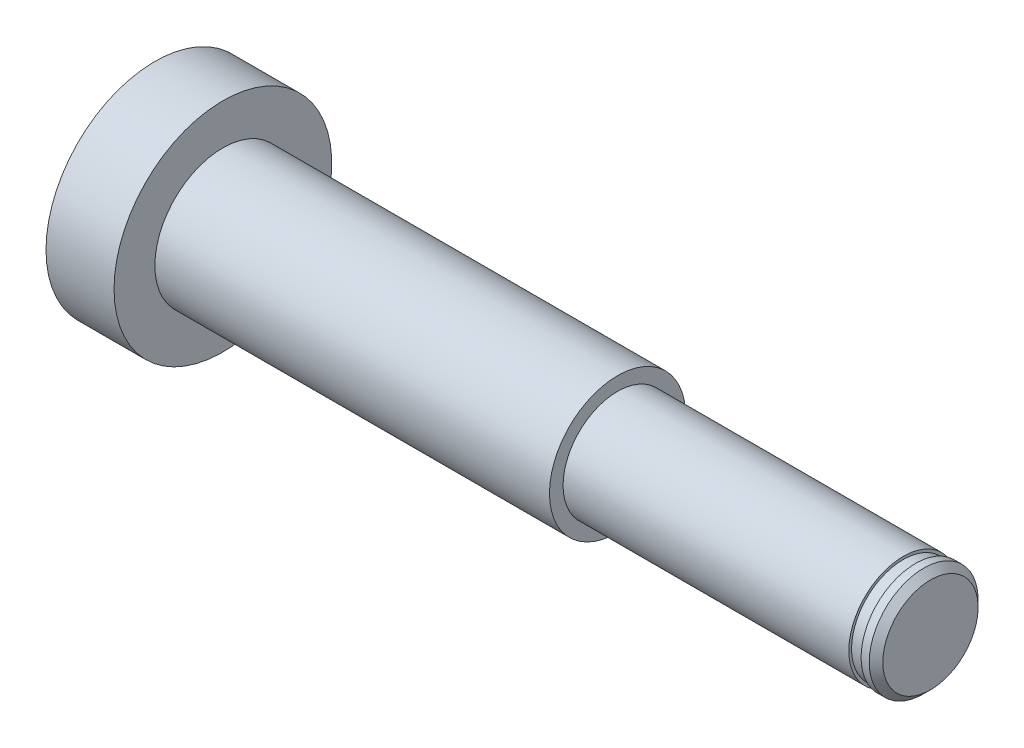
ISO-10303-21;
HEADER;
FILE_DESCRIPTION(('STEP AP214'),'2;1');
FILE_NAME('part.step','',(''),(''),'','','');
FILE_SCHEMA(('AUTOMOTIVE_DESIGN { 1 0 10303 214 1 1 1 1 }'));
ENDSEC;
DATA;
#1=APPLICATION_CONTEXT('core data for automotive mechanical design processes');
#2=APPLICATION_PROTOCOL_DEFINITION('international standard','automotive_design',2000,#1);
#3=PRODUCT_CONTEXT('',#1,'mechanical');
#4=PRODUCT('Part','Part','',(#3));
#5=PRODUCT_RELATED_PRODUCT_CATEGORY('part','',(#4));
#6=PRODUCT_DEFINITION_FORMATION('','',#4);
#7=PRODUCT_DEFINITION_CONTEXT('part definition',#1,'design');
#8=PRODUCT_DEFINITION('design','',#6,#7);
#9=PRODUCT_DEFINITION_SHAPE('','',#8);
#10=(LENGTH_UNIT() NAMED_UNIT(*) SI_UNIT(.MILLI.,.METRE.));
#11=(NAMED_UNIT(*) PLANE_ANGLE_UNIT() SI_UNIT($,.RADIAN.));
#12=(NAMED_UNIT(*) SI_UNIT($,.STERADIAN.) SOLID_ANGLE_UNIT());
#13=UNCERTAINTY_MEASURE_WITH_UNIT(LENGTH_MEASURE(1.E-05),#10,'distance_accuracy_value','');
#14=(GEOMETRIC_REPRESENTATION_CONTEXT(3) GLOBAL_UNCERTAINTY_ASSIGNED_CONTEXT((#13)) GLOBAL_UNIT_ASSIGNED_CONTEXT((#10,
#11,#12)) REPRESENTATION_CONTEXT('',''));
#15=CARTESIAN_POINT('',(0.,0.,0.));
#16=DIRECTION('',(0.,0.,1.));
#17=DIRECTION('',(1.,0.,0.));
#18=AXIS2_PLACEMENT_3D('',#15,#16,#17);
#19=CARTESIAN_POINT('',(-5.,0.,0.));
#20=DIRECTION('',(1.,0.,0.));
#21=DIRECTION('',(0.,0.,-1.));
#22=AXIS2_PLACEMENT_3D('',#19,#20,#21);
#23=PLANE('',#22);
#24=CARTESIAN_POINT('',(-5.,0.,0.));
#25=DIRECTION('',(-1.,0.,0.));
#26=DIRECTION('',(0.,0.,1.));
#27=AXIS2_PLACEMENT_3D('',#24,#25,#26);
#28=CIRCLE('',#27,8.);
#29=CARTESIAN_POINT('',(-5.,0.,8.));
#30=VERTEX_POINT('',#29);
#31=EDGE_CURVE('E43',#30,#30,#28,.T.);
#32=ORIENTED_EDGE('',*,*,#31,.T.);
#33=EDGE_LOOP('',(#32));
#34=FACE_BOUND('',#33,.T.);
#35=ADVANCED_FACE('F32',(#34),#23,.F.);
#36=CARTESIAN_POINT('',(0.,0.,0.));
#37=DIRECTION('',(-1.,0.,0.));
#38=DIRECTION('',(0.,0.,1.));
#39=AXIS2_PLACEMENT_3D('',#36,#37,#38);
#40=CYLINDRICAL_SURFACE('',#39,8.);
#41=ORIENTED_EDGE('',*,*,#31,.F.);
#42=EDGE_LOOP('',(#41));
#43=FACE_BOUND('',#42,.T.);
#44=CARTESIAN_POINT('',(0.,0.,0.));
#45=DIRECTION('',(-1.,0.,0.));
#46=DIRECTION('',(0.,0.,1.));
#47=AXIS2_PLACEMENT_3D('',#44,#45,#46);
#48=CIRCLE('',#47,8.);
#49=CARTESIAN_POINT('',(0.,0.,8.));
#50=VERTEX_POINT('',#49);
#51=EDGE_CURVE('E47',#50,#50,#48,.T.);
#52=ORIENTED_EDGE('',*,*,#51,.T.);
#53=EDGE_LOOP('',(#52));
#54=FACE_BOUND('',#53,.T.);
#55=ADVANCED_FACE('F89',(#43,#54),#40,.T.);
#56=CARTESIAN_POINT('',(0.,5.,0.));
#57=DIRECTION('',(-1.,0.,0.));
#58=DIRECTION('',(0.,0.,1.));
#59=AXIS2_PLACEMENT_3D('',#56,#57,#58);
#60=PLANE('',#59);
#61=ORIENTED_EDGE('',*,*,#51,.F.);
#62=EDGE_LOOP('',(#61));
#63=FACE_BOUND('',#62,.T.);
#64=CARTESIAN_POINT('',(0.,0.,0.));
#65=DIRECTION('',(-1.,0.,0.));
#66=DIRECTION('',(0.,0.,1.));
#67=AXIS2_PLACEMENT_3D('',#64,#65,#66);
#68=CIRCLE('',#67,5.);
#69=CARTESIAN_POINT('',(0.,0.,5.));
#70=VERTEX_POINT('',#69);
#71=EDGE_CURVE('E52',#70,#70,#68,.T.);
#72=ORIENTED_EDGE('',*,*,#71,.T.);
#73=EDGE_LOOP('',(#72));
#74=FACE_BOUND('',#73,.T.);
#75=ADVANCED_FACE('F94',(#63,#74),#60,.F.);
#76=CARTESIAN_POINT('',(0.,0.,0.));
#77=DIRECTION('',(-1.,0.,0.));
#78=DIRECTION('',(0.,0.,1.));
#79=AXIS2_PLACEMENT_3D('',#76,#77,#78);
#80=CYLINDRICAL_SURFACE('',#79,5.);
#81=ORIENTED_EDGE('',*,*,#71,.F.);
#82=EDGE_LOOP('',(#81));
#83=FACE_BOUND('',#82,.T.);
#84=CARTESIAN_POINT('',(29.,0.,0.));
#85=DIRECTION('',(-1.,0.,0.));
#86=DIRECTION('',(0.,0.,1.));
#87=AXIS2_PLACEMENT_3D('',#84,#85,#86);
#88=CIRCLE('',#87,5.);
#89=CARTESIAN_POINT('',(29.,0.,5.));
#90=VERTEX_POINT('',#89);
#91=EDGE_CURVE('E55',#90,#90,#88,.T.);
#92=ORIENTED_EDGE('',*,*,#91,.T.);
#93=EDGE_LOOP('',(#92));
#94=FACE_BOUND('',#93,.T.);
#95=ADVANCED_FACE('F100',(#83,#94),#80,.T.);
#96=CARTESIAN_POINT('',(29.,5.,0.));
#97=DIRECTION('',(-1.,0.,0.));
#98=DIRECTION('',(0.,0.,1.));
#99=AXIS2_PLACEMENT_3D('',#96,#97,#98);
#100=PLANE('',#99);
#101=ORIENTED_EDGE('',*,*,#91,.F.);
#102=EDGE_LOOP('',(#101));
#103=FACE_BOUND('',#102,.T.);
#104=CARTESIAN_POINT('',(29.,0.,0.));
#105=DIRECTION('',(-1.,0.,0.));
#106=DIRECTION('',(0.,0.,1.));
#107=AXIS2_PLACEMENT_3D('',#104,#105,#106);
#108=CIRCLE('',#107,4.);
#109=CARTESIAN_POINT('',(29.,0.,4.));
#110=VERTEX_POINT('',#109);
#111=EDGE_CURVE('E58',#110,#110,#108,.T.);
#112=ORIENTED_EDGE('',*,*,#111,.T.);
#113=EDGE_LOOP('',(#112));
#114=FACE_BOUND('',#113,.T.);
#115=ADVANCED_FACE('F104',(#103,#114),#100,.F.);
#116=CARTESIAN_POINT('',(0.,0.,0.));
#117=DIRECTION('',(-1.,0.,0.));
#118=DIRECTION('',(0.,0.,1.));
#119=AXIS2_PLACEMENT_3D('',#116,#117,#118);
#120=CYLINDRICAL_SURFACE('',#119,4.);
#121=ORIENTED_EDGE('',*,*,#111,.F.);
#122=EDGE_LOOP('',(#121));
#123=FACE_BOUND('',#122,.T.);
#124=CARTESIAN_POINT('',(50.,0.,0.));
#125=DIRECTION('',(-1.,0.,0.));
#126=DIRECTION('',(0.,0.,1.));
#127=AXIS2_PLACEMENT_3D('',#124,#125,#126);
#128=CIRCLE('',#127,4.);
#129=CARTESIAN_POINT('',(50.,0.,4.));
#130=VERTEX_POINT('',#129);
#131=EDGE_CURVE('E61',#130,#130,#128,.T.);
#132=ORIENTED_EDGE('',*,*,#131,.T.);
#133=EDGE_LOOP('',(#132));
#134=FACE_BOUND('',#133,.T.);
#135=ADVANCED_FACE('F108',(#123,#134),#120,.T.);
#136=CARTESIAN_POINT('',(50.,4.,0.));
#137=DIRECTION('',(-1.,0.,0.));
#138=DIRECTION('',(0.,0.,1.));
#139=AXIS2_PLACEMENT_3D('',#136,#137,#138);
#140=PLANE('',#139);
#141=ORIENTED_EDGE('',*,*,#131,.F.);
#142=EDGE_LOOP('',(#141));
#143=FACE_BOUND('',#142,.T.);
#144=CARTESIAN_POINT('',(50.,0.,0.));
#145=DIRECTION('',(-1.,0.,0.));
#146=DIRECTION('',(0.,0.,1.));
#147=AXIS2_PLACEMENT_3D('',#144,#145,#146);
#148=CIRCLE('',#147,3.80000000000001);
#149=CARTESIAN_POINT('',(50.,0.,3.80000000000001));
#150=VERTEX_POINT('',#149);
#151=EDGE_CURVE('E64',#150,#150,#148,.T.);
#152=ORIENTED_EDGE('',*,*,#151,.T.);
#153=EDGE_LOOP('',(#152));
#154=FACE_BOUND('',#153,.T.);
#155=ADVANCED_FACE('F112',(#143,#154),#140,.F.);
#156=CARTESIAN_POINT('',(0.,0.,0.));
#157=DIRECTION('',(-1.,0.,0.));
#158=DIRECTION('',(0.,0.,1.));
#159=AXIS2_PLACEMENT_3D('',#156,#157,#158);
#160=CYLINDRICAL_SURFACE('',#159,3.80000000000001);
#161=ORIENTED_EDGE('',*,*,#151,.F.);
#162=EDGE_LOOP('',(#161));
#163=FACE_BOUND('',#162,.T.);
#164=CARTESIAN_POINT('',(50.9,0.,0.));
#165=DIRECTION('',(-1.,0.,0.));
#166=DIRECTION('',(0.,0.,1.));
#167=AXIS2_PLACEMENT_3D('',#164,#165,#166);
#168=CIRCLE('',#167,3.80000000000001);
#169=CARTESIAN_POINT('',(50.9,0.,3.80000000000001));
#170=VERTEX_POINT('',#169);
#171=EDGE_CURVE('E67',#170,#170,#168,.T.);
#172=ORIENTED_EDGE('',*,*,#171,.T.);
#173=EDGE_LOOP('',(#172));
#174=FACE_BOUND('',#173,.T.);
#175=ADVANCED_FACE('F85',(#163,#174),#160,.T.);
#176=CARTESIAN_POINT('',(50.9,4.,0.));
#177=DIRECTION('',(1.,0.,0.));
#178=DIRECTION('',(0.,0.,-1.));
#179=AXIS2_PLACEMENT_3D('',#176,#177,#178);
#180=PLANE('',#179);
#181=ORIENTED_EDGE('',*,*,#171,.F.);
#182=EDGE_LOOP('',(#181));
#183=FACE_BOUND('',#182,.T.);
#184=CARTESIAN_POINT('',(50.9,0.,0.));
#185=DIRECTION('',(-1.,0.,0.));
#186=DIRECTION('',(0.,0.,1.));
#187=AXIS2_PLACEMENT_3D('',#184,#185,#186);
#188=CIRCLE('',#187,4.);
#189=CARTESIAN_POINT('',(50.9,0.,4.));
#190=VERTEX_POINT('',#189);
#191=EDGE_CURVE('E70',#190,#190,#188,.T.);
#192=ORIENTED_EDGE('',*,*,#191,.T.);
#193=EDGE_LOOP('',(#192));
#194=FACE_BOUND('',#193,.T.);
#195=ADVANCED_FACE('F74',(#183,#194),#180,.F.);
#196=CARTESIAN_POINT('',(0.,0.,0.));
#197=DIRECTION('',(-1.,0.,0.));
#198=DIRECTION('',(0.,0.,1.));
#199=AXIS2_PLACEMENT_3D('',#196,#197,#198);
#200=CYLINDRICAL_SURFACE('',#199,4.);
#201=CARTESIAN_POINT('',(51.5,0.,0.));
#202=DIRECTION('',(-1.,0.,0.));
#203=DIRECTION('',(0.,0.,1.));
#204=AXIS2_PLACEMENT_3D('',#201,#202,#203);
#205=CIRCLE('',#204,4.);
#206=CARTESIAN_POINT('',(51.5,0.,4.));
#207=VERTEX_POINT('',#206);
#208=EDGE_CURVE('E39',#207,#207,#205,.T.);
#209=ORIENTED_EDGE('',*,*,#208,.T.);
#210=EDGE_LOOP('',(#209));
#211=FACE_BOUND('',#210,.T.);
#212=ORIENTED_EDGE('',*,*,#191,.F.);
#213=EDGE_LOOP('',(#212));
#214=FACE_BOUND('',#213,.T.);
#215=ADVANCED_FACE('F76',(#211,#214),#200,.T.);
#216=CARTESIAN_POINT('',(52.,4.,0.));
#217=DIRECTION('',(-1.,0.,0.));
#218=DIRECTION('',(0.,0.,1.));
#219=AXIS2_PLACEMENT_3D('',#216,#217,#218);
#220=PLANE('',#219);
#221=CARTESIAN_POINT('',(52.,0.,0.));
#222=DIRECTION('',(-1.,0.,0.));
#223=DIRECTION('',(0.,0.,1.));
#224=AXIS2_PLACEMENT_3D('',#221,#222,#223);
#225=CIRCLE('',#224,3.5);
#226=CARTESIAN_POINT('',(52.,0.,3.5));
#227=VERTEX_POINT('',#226);
#228=EDGE_CURVE('E10',#227,#227,#225,.F.);
#229=ORIENTED_EDGE('',*,*,#228,.T.);
#230=EDGE_LOOP('',(#229));
#231=FACE_BOUND('',#230,.T.);
#232=ADVANCED_FACE('F78',(#231),#220,.F.);
#233=CARTESIAN_POINT('',(51.5,0.,0.));
#234=DIRECTION('',(-1.,0.,0.));
#235=DIRECTION('',(0.,0.,1.));
#236=AXIS2_PLACEMENT_3D('',#233,#234,#235);
#237=CONICAL_SURFACE('',#236,4.,0.785398163397445);
#238=ORIENTED_EDGE('',*,*,#228,.F.);
#239=EDGE_LOOP('',(#238));
#240=FACE_BOUND('',#239,.T.);
#241=ORIENTED_EDGE('',*,*,#208,.F.);
#242=EDGE_LOOP('',(#241));
#243=FACE_BOUND('',#242,.T.);
#244=ADVANCED_FACE('F34',(#240,#243),#237,.T.);
#245=CLOSED_SHELL('',(#35,#55,#75,#95,#115,#135,#155,#175,#195,#215,#232,#244));
#246=MANIFOLD_SOLID_BREP('B2',#245);
#247=ADVANCED_BREP_SHAPE_REPRESENTATION('',(#18,#246),#14);
#248=SHAPE_DEFINITION_REPRESENTATION(#9,#247);
ENDSEC;
END-ISO-10303-21;
